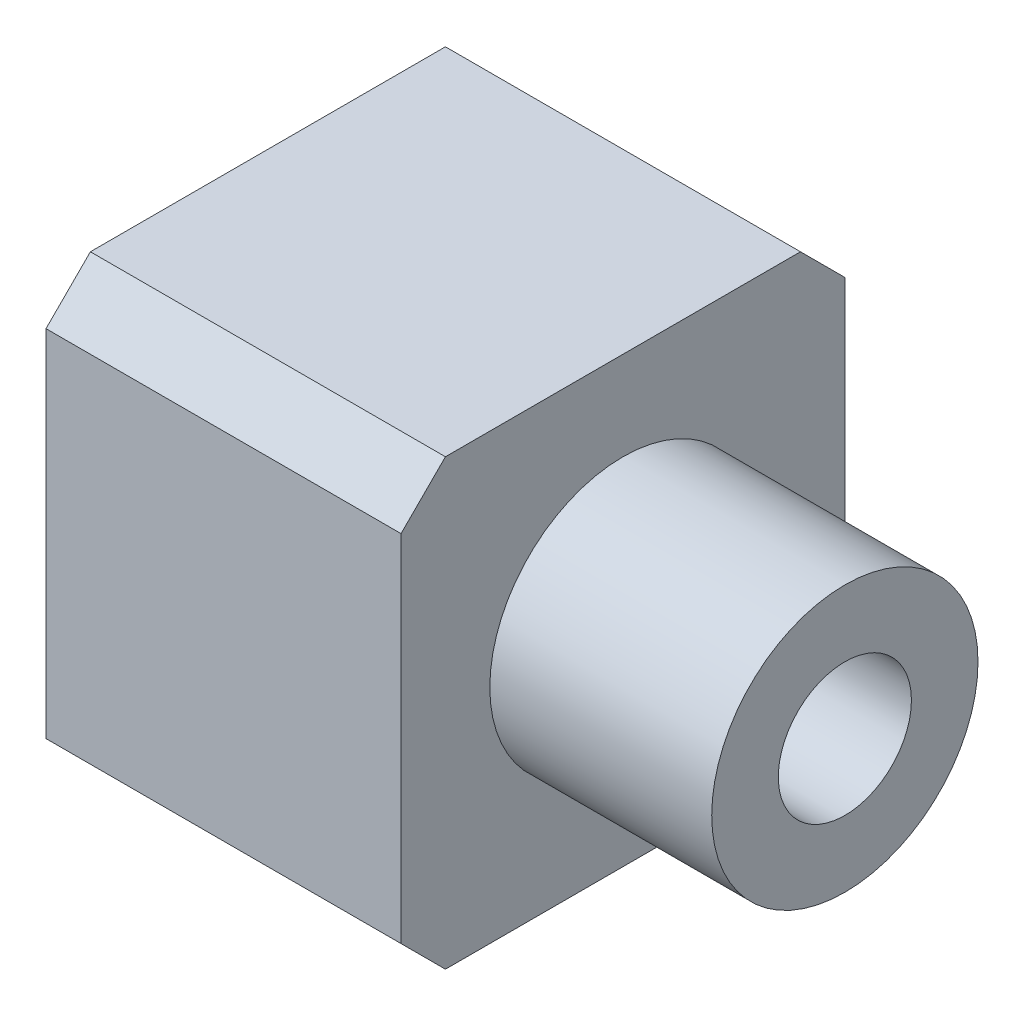
ISO-10303-21;
HEADER;
FILE_DESCRIPTION(('STEP AP214'),'2;1');
FILE_NAME('part.step','',(''),(''),'','','');
FILE_SCHEMA(('AUTOMOTIVE_DESIGN { 1 0 10303 214 1 1 1 1 }'));
ENDSEC;
DATA;
#1=APPLICATION_CONTEXT('core data for automotive mechanical design processes');
#2=APPLICATION_PROTOCOL_DEFINITION('international standard','automotive_design',2000,#1);
#3=PRODUCT_CONTEXT('',#1,'mechanical');
#4=PRODUCT('Part','Part','',(#3));
#5=PRODUCT_RELATED_PRODUCT_CATEGORY('part','',(#4));
#6=PRODUCT_DEFINITION_FORMATION('','',#4);
#7=PRODUCT_DEFINITION_CONTEXT('part definition',#1,'design');
#8=PRODUCT_DEFINITION('design','',#6,#7);
#9=PRODUCT_DEFINITION_SHAPE('','',#8);
#10=(LENGTH_UNIT() NAMED_UNIT(*) SI_UNIT(.MILLI.,.METRE.));
#11=(NAMED_UNIT(*) PLANE_ANGLE_UNIT() SI_UNIT($,.RADIAN.));
#12=(NAMED_UNIT(*) SI_UNIT($,.STERADIAN.) SOLID_ANGLE_UNIT());
#13=UNCERTAINTY_MEASURE_WITH_UNIT(LENGTH_MEASURE(1.E-05),#10,'distance_accuracy_value','');
#14=(GEOMETRIC_REPRESENTATION_CONTEXT(3) GLOBAL_UNCERTAINTY_ASSIGNED_CONTEXT((#13)) GLOBAL_UNIT_ASSIGNED_CONTEXT((#10,
#11,#12)) REPRESENTATION_CONTEXT('',''));
#15=CARTESIAN_POINT('',(0.,0.,0.));
#16=DIRECTION('',(0.,0.,1.));
#17=DIRECTION('',(1.,0.,0.));
#18=AXIS2_PLACEMENT_3D('',#15,#16,#17);
#19=CARTESIAN_POINT('',(-15.,-5.,5.));
#20=DIRECTION('',(0.,0.,1.));
#21=DIRECTION('',(1.,0.,0.));
#22=AXIS2_PLACEMENT_3D('',#19,#20,#21);
#23=PLANE('',#22);
#24=DIRECTION('',(0.,1.,0.));
#25=VECTOR('',#24,1.);
#26=CARTESIAN_POINT('',(-5.,-5.,5.));
#27=LINE('',#26,#25);
#28=CARTESIAN_POINT('',(-5.,-4.,5.));
#29=VERTEX_POINT('',#28);
#30=CARTESIAN_POINT('',(-5.,3.99999999999999,5.));
#31=VERTEX_POINT('',#30);
#32=EDGE_CURVE('E134',#29,#31,#27,.T.);
#33=ORIENTED_EDGE('',*,*,#32,.T.);
#34=DIRECTION('',(-1.,0.,0.));
#35=VECTOR('',#34,1.);
#36=CARTESIAN_POINT('',(-15.,3.99999999999999,5.));
#37=LINE('',#36,#35);
#38=CARTESIAN_POINT('',(-13.,3.99999999999999,5.));
#39=VERTEX_POINT('',#38);
#40=EDGE_CURVE('E11',#31,#39,#37,.T.);
#41=ORIENTED_EDGE('',*,*,#40,.T.);
#42=DIRECTION('',(0.,-1.,0.));
#43=VECTOR('',#42,1.);
#44=CARTESIAN_POINT('',(-13.,-5.,5.));
#45=LINE('',#44,#43);
#46=CARTESIAN_POINT('',(-13.,-4.,5.));
#47=VERTEX_POINT('',#46);
#48=EDGE_CURVE('E135',#39,#47,#45,.T.);
#49=ORIENTED_EDGE('',*,*,#48,.T.);
#50=DIRECTION('',(1.,0.,0.));
#51=VECTOR('',#50,1.);
#52=CARTESIAN_POINT('',(-15.,-4.,5.));
#53=LINE('',#52,#51);
#54=EDGE_CURVE('E43',#47,#29,#53,.T.);
#55=ORIENTED_EDGE('',*,*,#54,.T.);
#56=EDGE_LOOP('',(#33,#41,#49,#55));
#57=FACE_BOUND('',#56,.T.);
#58=ADVANCED_FACE('F35',(#57),#23,.T.);
#59=CARTESIAN_POINT('',(-15.,5.,-5.));
#60=DIRECTION('',(0.,1.,0.));
#61=DIRECTION('',(0.,0.,1.));
#62=AXIS2_PLACEMENT_3D('',#59,#60,#61);
#63=PLANE('',#62);
#64=DIRECTION('',(0.,0.,1.));
#65=VECTOR('',#64,1.);
#66=CARTESIAN_POINT('',(-13.,5.,-5.));
#67=LINE('',#66,#65);
#68=CARTESIAN_POINT('',(-13.,5.,-4.));
#69=VERTEX_POINT('',#68);
#70=CARTESIAN_POINT('',(-13.,5.,4.));
#71=VERTEX_POINT('',#70);
#72=EDGE_CURVE('E170',#69,#71,#67,.T.);
#73=ORIENTED_EDGE('',*,*,#72,.T.);
#74=DIRECTION('',(1.,0.,0.));
#75=VECTOR('',#74,1.);
#76=CARTESIAN_POINT('',(-15.,5.,4.));
#77=LINE('',#76,#75);
#78=CARTESIAN_POINT('',(-5.,5.,4.));
#79=VERTEX_POINT('',#78);
#80=EDGE_CURVE('E131',#71,#79,#77,.T.);
#81=ORIENTED_EDGE('',*,*,#80,.T.);
#82=DIRECTION('',(0.,0.,-1.));
#83=VECTOR('',#82,1.);
#84=CARTESIAN_POINT('',(-5.,5.,-5.));
#85=LINE('',#84,#83);
#86=CARTESIAN_POINT('',(-5.,5.,-4.));
#87=VERTEX_POINT('',#86);
#88=EDGE_CURVE('E142',#79,#87,#85,.T.);
#89=ORIENTED_EDGE('',*,*,#88,.T.);
#90=DIRECTION('',(-1.,0.,0.));
#91=VECTOR('',#90,1.);
#92=CARTESIAN_POINT('',(-15.,5.,-4.));
#93=LINE('',#92,#91);
#94=EDGE_CURVE('E129',#87,#69,#93,.T.);
#95=ORIENTED_EDGE('',*,*,#94,.T.);
#96=EDGE_LOOP('',(#73,#81,#89,#95));
#97=FACE_BOUND('',#96,.T.);
#98=ADVANCED_FACE('F211',(#97),#63,.T.);
#99=CARTESIAN_POINT('',(-15.,-5.,-5.));
#100=DIRECTION('',(0.,0.,-1.));
#101=DIRECTION('',(-1.,0.,0.));
#102=AXIS2_PLACEMENT_3D('',#99,#100,#101);
#103=PLANE('',#102);
#104=CARTESIAN_POINT('',(-9.,0.,-5.));
#105=DIRECTION('',(0.,0.,-1.));
#106=DIRECTION('',(-1.,0.,0.));
#107=AXIS2_PLACEMENT_3D('',#104,#105,#106);
#108=CIRCLE('',#107,1.5);
#109=CARTESIAN_POINT('',(-10.5,0.,-5.));
#110=VERTEX_POINT('',#109);
#111=EDGE_CURVE('E196',#110,#110,#108,.T.);
#112=ORIENTED_EDGE('',*,*,#111,.F.);
#113=EDGE_LOOP('',(#112));
#114=FACE_BOUND('',#113,.T.);
#115=DIRECTION('',(0.,-1.,0.));
#116=VECTOR('',#115,1.);
#117=CARTESIAN_POINT('',(-5.,-5.,-5.));
#118=LINE('',#117,#116);
#119=CARTESIAN_POINT('',(-5.,4.00000000000001,-5.));
#120=VERTEX_POINT('',#119);
#121=CARTESIAN_POINT('',(-5.,-3.99999999999999,-5.));
#122=VERTEX_POINT('',#121);
#123=EDGE_CURVE('E146',#120,#122,#118,.T.);
#124=ORIENTED_EDGE('',*,*,#123,.T.);
#125=DIRECTION('',(-1.,0.,0.));
#126=VECTOR('',#125,1.);
#127=CARTESIAN_POINT('',(-15.,-3.99999999999999,-5.));
#128=LINE('',#127,#126);
#129=CARTESIAN_POINT('',(-13.,-3.99999999999999,-5.));
#130=VERTEX_POINT('',#129);
#131=EDGE_CURVE('E124',#122,#130,#128,.T.);
#132=ORIENTED_EDGE('',*,*,#131,.T.);
#133=DIRECTION('',(0.,1.,0.));
#134=VECTOR('',#133,1.);
#135=CARTESIAN_POINT('',(-13.,-5.,-5.));
#136=LINE('',#135,#134);
#137=CARTESIAN_POINT('',(-13.,4.00000000000001,-5.));
#138=VERTEX_POINT('',#137);
#139=EDGE_CURVE('E164',#130,#138,#136,.T.);
#140=ORIENTED_EDGE('',*,*,#139,.T.);
#141=DIRECTION('',(1.,0.,0.));
#142=VECTOR('',#141,1.);
#143=CARTESIAN_POINT('',(-15.,4.00000000000001,-5.));
#144=LINE('',#143,#142);
#145=EDGE_CURVE('E157',#138,#120,#144,.T.);
#146=ORIENTED_EDGE('',*,*,#145,.T.);
#147=EDGE_LOOP('',(#124,#132,#140,#146));
#148=FACE_BOUND('',#147,.T.);
#149=ADVANCED_FACE('F163',(#114,#148),#103,.T.);
#150=CARTESIAN_POINT('',(-15.,-5.,-5.));
#151=DIRECTION('',(0.,-1.,0.));
#152=DIRECTION('',(0.,0.,-1.));
#153=AXIS2_PLACEMENT_3D('',#150,#151,#152);
#154=PLANE('',#153);
#155=DIRECTION('',(0.,0.,-1.));
#156=VECTOR('',#155,1.);
#157=CARTESIAN_POINT('',(-13.,-5.,-5.));
#158=LINE('',#157,#156);
#159=CARTESIAN_POINT('',(-13.,-5.,4.));
#160=VERTEX_POINT('',#159);
#161=CARTESIAN_POINT('',(-13.,-5.,-4.));
#162=VERTEX_POINT('',#161);
#163=EDGE_CURVE('E104',#160,#162,#158,.T.);
#164=ORIENTED_EDGE('',*,*,#163,.T.);
#165=DIRECTION('',(1.,0.,0.));
#166=VECTOR('',#165,1.);
#167=CARTESIAN_POINT('',(-15.,-5.,-4.));
#168=LINE('',#167,#166);
#169=CARTESIAN_POINT('',(-5.,-5.,-4.));
#170=VERTEX_POINT('',#169);
#171=EDGE_CURVE('E109',#162,#170,#168,.T.);
#172=ORIENTED_EDGE('',*,*,#171,.T.);
#173=DIRECTION('',(0.,0.,1.));
#174=VECTOR('',#173,1.);
#175=CARTESIAN_POINT('',(-5.,-5.,-5.));
#176=LINE('',#175,#174);
#177=CARTESIAN_POINT('',(-5.,-5.,4.));
#178=VERTEX_POINT('',#177);
#179=EDGE_CURVE('E107',#170,#178,#176,.T.);
#180=ORIENTED_EDGE('',*,*,#179,.T.);
#181=DIRECTION('',(-1.,0.,0.));
#182=VECTOR('',#181,1.);
#183=CARTESIAN_POINT('',(-15.,-5.,4.));
#184=LINE('',#183,#182);
#185=EDGE_CURVE('E101',#178,#160,#184,.T.);
#186=ORIENTED_EDGE('',*,*,#185,.T.);
#187=EDGE_LOOP('',(#164,#172,#180,#186));
#188=FACE_BOUND('',#187,.T.);
#189=ADVANCED_FACE('F102',(#188),#154,.T.);
#190=CARTESIAN_POINT('',(-5.,0.,0.));
#191=DIRECTION('',(1.,0.,0.));
#192=DIRECTION('',(0.,0.,-1.));
#193=AXIS2_PLACEMENT_3D('',#190,#191,#192);
#194=PLANE('',#193);
#195=ORIENTED_EDGE('',*,*,#179,.F.);
#196=DIRECTION('',(0.,-0.707106781186549,0.707106781186546));
#197=VECTOR('',#196,1.);
#198=CARTESIAN_POINT('',(-5.,-4.49999999999999,-4.50000000000001));
#199=LINE('',#198,#197);
#200=EDGE_CURVE('E155',#170,#122,#199,.F.);
#201=ORIENTED_EDGE('',*,*,#200,.T.);
#202=ORIENTED_EDGE('',*,*,#123,.F.);
#203=DIRECTION('',(0.,-0.707106781186546,-0.707106781186549));
#204=VECTOR('',#203,1.);
#205=CARTESIAN_POINT('',(-5.,4.50000000000001,-4.49999999999999));
#206=LINE('',#205,#204);
#207=EDGE_CURVE('E151',#120,#87,#206,.F.);
#208=ORIENTED_EDGE('',*,*,#207,.T.);
#209=ORIENTED_EDGE('',*,*,#88,.F.);
#210=DIRECTION('',(0.,0.707106781186549,-0.707106781186546));
#211=VECTOR('',#210,1.);
#212=CARTESIAN_POINT('',(-5.,4.49999999999999,4.50000000000001));
#213=LINE('',#212,#211);
#214=EDGE_CURVE('E141',#79,#31,#213,.F.);
#215=ORIENTED_EDGE('',*,*,#214,.T.);
#216=ORIENTED_EDGE('',*,*,#32,.F.);
#217=DIRECTION('',(0.,0.707106781186546,0.707106781186549));
#218=VECTOR('',#217,1.);
#219=CARTESIAN_POINT('',(-5.,-4.50000000000001,4.49999999999999));
#220=LINE('',#219,#218);
#221=EDGE_CURVE('E139',#29,#178,#220,.F.);
#222=ORIENTED_EDGE('',*,*,#221,.T.);
#223=EDGE_LOOP('',(#195,#201,#202,#208,#209,#215,#216,#222));
#224=FACE_BOUND('',#223,.T.);
#225=CARTESIAN_POINT('',(-5.,0.,0.));
#226=DIRECTION('',(1.,0.,0.));
#227=DIRECTION('',(0.,0.,-1.));
#228=AXIS2_PLACEMENT_3D('',#225,#226,#227);
#229=CIRCLE('',#228,3.);
#230=CARTESIAN_POINT('',(-5.,0.,-3.));
#231=VERTEX_POINT('',#230);
#232=EDGE_CURVE('E174',#231,#231,#229,.T.);
#233=ORIENTED_EDGE('',*,*,#232,.F.);
#234=EDGE_LOOP('',(#233));
#235=FACE_BOUND('',#234,.T.);
#236=ADVANCED_FACE('F137',(#224,#235),#194,.T.);
#237=CARTESIAN_POINT('',(-5.,0.,0.));
#238=DIRECTION('',(1.,0.,0.));
#239=DIRECTION('',(0.,0.,-1.));
#240=AXIS2_PLACEMENT_3D('',#237,#238,#239);
#241=CYLINDRICAL_SURFACE('',#240,3.);
#242=ORIENTED_EDGE('',*,*,#232,.T.);
#243=EDGE_LOOP('',(#242));
#244=FACE_BOUND('',#243,.T.);
#245=CARTESIAN_POINT('',(0.,0.,0.));
#246=DIRECTION('',(1.,0.,0.));
#247=DIRECTION('',(0.,0.,-1.));
#248=AXIS2_PLACEMENT_3D('',#245,#246,#247);
#249=CIRCLE('',#248,3.);
#250=CARTESIAN_POINT('',(0.,0.,-3.));
#251=VERTEX_POINT('',#250);
#252=EDGE_CURVE('E176',#251,#251,#249,.T.);
#253=ORIENTED_EDGE('',*,*,#252,.F.);
#254=EDGE_LOOP('',(#253));
#255=FACE_BOUND('',#254,.T.);
#256=ADVANCED_FACE('F329',(#244,#255),#241,.T.);
#257=CARTESIAN_POINT('',(0.,0.,0.));
#258=DIRECTION('',(1.,0.,0.));
#259=DIRECTION('',(0.,0.,-1.));
#260=AXIS2_PLACEMENT_3D('',#257,#258,#259);
#261=PLANE('',#260);
#262=CARTESIAN_POINT('',(0.,0.,0.));
#263=DIRECTION('',(1.,0.,0.));
#264=DIRECTION('',(0.,0.,-1.));
#265=AXIS2_PLACEMENT_3D('',#262,#263,#264);
#266=CIRCLE('',#265,1.5);
#267=CARTESIAN_POINT('',(0.,0.,-1.5));
#268=VERTEX_POINT('',#267);
#269=EDGE_CURVE('E190',#268,#268,#266,.T.);
#270=ORIENTED_EDGE('',*,*,#269,.F.);
#271=EDGE_LOOP('',(#270));
#272=FACE_BOUND('',#271,.T.);
#273=ORIENTED_EDGE('',*,*,#252,.T.);
#274=EDGE_LOOP('',(#273));
#275=FACE_BOUND('',#274,.T.);
#276=ADVANCED_FACE('F300',(#272,#275),#261,.T.);
#277=CARTESIAN_POINT('',(-13.,0.,0.));
#278=DIRECTION('',(-1.,0.,0.));
#279=DIRECTION('',(0.,0.,1.));
#280=AXIS2_PLACEMENT_3D('',#277,#278,#279);
#281=PLANE('',#280);
#282=ORIENTED_EDGE('',*,*,#139,.F.);
#283=DIRECTION('',(0.,0.707106781186549,-0.707106781186546));
#284=VECTOR('',#283,1.);
#285=CARTESIAN_POINT('',(-13.,-4.49999999999999,-4.50000000000001));
#286=LINE('',#285,#284);
#287=EDGE_CURVE('E115',#130,#162,#286,.F.);
#288=ORIENTED_EDGE('',*,*,#287,.T.);
#289=ORIENTED_EDGE('',*,*,#163,.F.);
#290=DIRECTION('',(0.,-0.707106781186546,-0.707106781186549));
#291=VECTOR('',#290,1.);
#292=CARTESIAN_POINT('',(-13.,-4.50000000000001,4.49999999999999));
#293=LINE('',#292,#291);
#294=EDGE_CURVE('E50',#160,#47,#293,.F.);
#295=ORIENTED_EDGE('',*,*,#294,.T.);
#296=ORIENTED_EDGE('',*,*,#48,.F.);
#297=DIRECTION('',(0.,-0.707106781186549,0.707106781186546));
#298=VECTOR('',#297,1.);
#299=CARTESIAN_POINT('',(-13.,4.49999999999999,4.50000000000001));
#300=LINE('',#299,#298);
#301=EDGE_CURVE('E120',#39,#71,#300,.F.);
#302=ORIENTED_EDGE('',*,*,#301,.T.);
#303=ORIENTED_EDGE('',*,*,#72,.F.);
#304=DIRECTION('',(0.,0.707106781186546,0.707106781186549));
#305=VECTOR('',#304,1.);
#306=CARTESIAN_POINT('',(-13.,4.50000000000001,-4.49999999999999));
#307=LINE('',#306,#305);
#308=EDGE_CURVE('E121',#69,#138,#307,.F.);
#309=ORIENTED_EDGE('',*,*,#308,.T.);
#310=EDGE_LOOP('',(#282,#288,#289,#295,#296,#302,#303,#309));
#311=FACE_BOUND('',#310,.T.);
#312=CARTESIAN_POINT('',(-13.,0.,0.));
#313=DIRECTION('',(-1.,0.,0.));
#314=DIRECTION('',(0.,0.,1.));
#315=AXIS2_PLACEMENT_3D('',#312,#313,#314);
#316=CIRCLE('',#315,3.);
#317=CARTESIAN_POINT('',(-13.,0.,3.));
#318=VERTEX_POINT('',#317);
#319=EDGE_CURVE('E171',#318,#318,#316,.T.);
#320=ORIENTED_EDGE('',*,*,#319,.F.);
#321=EDGE_LOOP('',(#320));
#322=FACE_BOUND('',#321,.T.);
#323=ADVANCED_FACE('F112',(#311,#322),#281,.T.);
#324=CARTESIAN_POINT('',(-13.,0.,0.));
#325=DIRECTION('',(-1.,0.,0.));
#326=DIRECTION('',(0.,0.,1.));
#327=AXIS2_PLACEMENT_3D('',#324,#325,#326);
#328=CYLINDRICAL_SURFACE('',#327,3.);
#329=ORIENTED_EDGE('',*,*,#319,.T.);
#330=EDGE_LOOP('',(#329));
#331=FACE_BOUND('',#330,.T.);
#332=CARTESIAN_POINT('',(-15.,0.,0.));
#333=DIRECTION('',(-1.,0.,0.));
#334=DIRECTION('',(0.,0.,1.));
#335=AXIS2_PLACEMENT_3D('',#332,#333,#334);
#336=CIRCLE('',#335,3.);
#337=CARTESIAN_POINT('',(-15.,0.,3.));
#338=VERTEX_POINT('',#337);
#339=EDGE_CURVE('E184',#338,#338,#336,.T.);
#340=ORIENTED_EDGE('',*,*,#339,.F.);
#341=EDGE_LOOP('',(#340));
#342=FACE_BOUND('',#341,.T.);
#343=ADVANCED_FACE('F285',(#331,#342),#328,.T.);
#344=CARTESIAN_POINT('',(-15.,0.,0.));
#345=DIRECTION('',(1.,0.,0.));
#346=DIRECTION('',(0.,0.,-1.));
#347=AXIS2_PLACEMENT_3D('',#344,#345,#346);
#348=PLANE('',#347);
#349=CARTESIAN_POINT('',(-15.,0.,0.));
#350=DIRECTION('',(1.,0.,0.));
#351=DIRECTION('',(0.,0.,-1.));
#352=AXIS2_PLACEMENT_3D('',#349,#350,#351);
#353=CIRCLE('',#352,1.5);
#354=CARTESIAN_POINT('',(-15.,0.,-1.5));
#355=VERTEX_POINT('',#354);
#356=EDGE_CURVE('E187',#355,#355,#353,.T.);
#357=ORIENTED_EDGE('',*,*,#356,.T.);
#358=EDGE_LOOP('',(#357));
#359=FACE_BOUND('',#358,.T.);
#360=ORIENTED_EDGE('',*,*,#339,.T.);
#361=EDGE_LOOP('',(#360));
#362=FACE_BOUND('',#361,.T.);
#363=ADVANCED_FACE('F280',(#359,#362),#348,.F.);
#364=CARTESIAN_POINT('',(-15.,0.,0.));
#365=DIRECTION('',(1.,0.,0.));
#366=DIRECTION('',(0.,0.,-1.));
#367=AXIS2_PLACEMENT_3D('',#364,#365,#366);
#368=CYLINDRICAL_SURFACE('',#367,1.5);
#369=ORIENTED_EDGE('',*,*,#356,.F.);
#370=EDGE_LOOP('',(#369));
#371=FACE_BOUND('',#370,.T.);
#372=ORIENTED_EDGE('',*,*,#269,.T.);
#373=EDGE_LOOP('',(#372));
#374=FACE_BOUND('',#373,.T.);
#375=ADVANCED_FACE('F228',(#371,#374),#368,.F.);
#376=CARTESIAN_POINT('',(-15.,-5.,-4.));
#377=DIRECTION('',(0.,0.707106781186546,0.707106781186549));
#378=DIRECTION('',(1.,0.,0.));
#379=AXIS2_PLACEMENT_3D('',#376,#377,#378);
#380=PLANE('',#379);
#381=ORIENTED_EDGE('',*,*,#287,.F.);
#382=ORIENTED_EDGE('',*,*,#131,.F.);
#383=ORIENTED_EDGE('',*,*,#200,.F.);
#384=ORIENTED_EDGE('',*,*,#171,.F.);
#385=EDGE_LOOP('',(#381,#382,#383,#384));
#386=FACE_BOUND('',#385,.T.);
#387=ADVANCED_FACE('F173',(#386),#380,.F.);
#388=CARTESIAN_POINT('',(-15.,5.,4.));
#389=DIRECTION('',(0.,-0.707106781186546,-0.707106781186549));
#390=DIRECTION('',(1.,0.,0.));
#391=AXIS2_PLACEMENT_3D('',#388,#389,#390);
#392=PLANE('',#391);
#393=ORIENTED_EDGE('',*,*,#301,.F.);
#394=ORIENTED_EDGE('',*,*,#40,.F.);
#395=ORIENTED_EDGE('',*,*,#214,.F.);
#396=ORIENTED_EDGE('',*,*,#80,.F.);
#397=EDGE_LOOP('',(#393,#394,#395,#396));
#398=FACE_BOUND('',#397,.T.);
#399=ADVANCED_FACE('F227',(#398),#392,.F.);
#400=CARTESIAN_POINT('',(-15.,-4.,5.));
#401=DIRECTION('',(0.,0.707106781186549,-0.707106781186546));
#402=DIRECTION('',(1.,0.,0.));
#403=AXIS2_PLACEMENT_3D('',#400,#401,#402);
#404=PLANE('',#403);
#405=ORIENTED_EDGE('',*,*,#294,.F.);
#406=ORIENTED_EDGE('',*,*,#185,.F.);
#407=ORIENTED_EDGE('',*,*,#221,.F.);
#408=ORIENTED_EDGE('',*,*,#54,.F.);
#409=EDGE_LOOP('',(#405,#406,#407,#408));
#410=FACE_BOUND('',#409,.T.);
#411=ADVANCED_FACE('F118',(#410),#404,.F.);
#412=CARTESIAN_POINT('',(-15.,4.00000000000001,-5.));
#413=DIRECTION('',(0.,-0.707106781186549,0.707106781186546));
#414=DIRECTION('',(1.,0.,0.));
#415=AXIS2_PLACEMENT_3D('',#412,#413,#414);
#416=PLANE('',#415);
#417=ORIENTED_EDGE('',*,*,#308,.F.);
#418=ORIENTED_EDGE('',*,*,#94,.F.);
#419=ORIENTED_EDGE('',*,*,#207,.F.);
#420=ORIENTED_EDGE('',*,*,#145,.F.);
#421=EDGE_LOOP('',(#417,#418,#419,#420));
#422=FACE_BOUND('',#421,.T.);
#423=ADVANCED_FACE('F37',(#422),#416,.F.);
#424=CARTESIAN_POINT('',(-9.,0.,-3.));
#425=DIRECTION('',(0.,0.,-1.));
#426=DIRECTION('',(-1.,0.,0.));
#427=AXIS2_PLACEMENT_3D('',#424,#425,#426);
#428=CYLINDRICAL_SURFACE('',#427,1.5);
#429=CARTESIAN_POINT('',(-9.,0.,-3.));
#430=DIRECTION('',(0.,0.,-1.));
#431=DIRECTION('',(-1.,0.,0.));
#432=AXIS2_PLACEMENT_3D('',#429,#430,#431);
#433=CIRCLE('',#432,1.5);
#434=CARTESIAN_POINT('',(-10.5,0.,-3.));
#435=VERTEX_POINT('',#434);
#436=EDGE_CURVE('E193',#435,#435,#433,.T.);
#437=ORIENTED_EDGE('',*,*,#436,.F.);
#438=EDGE_LOOP('',(#437));
#439=FACE_BOUND('',#438,.T.);
#440=ORIENTED_EDGE('',*,*,#111,.T.);
#441=EDGE_LOOP('',(#440));
#442=FACE_BOUND('',#441,.T.);
#443=ADVANCED_FACE('F204',(#439,#442),#428,.F.);
#444=CARTESIAN_POINT('',(-9.,0.,-3.));
#445=DIRECTION('',(0.,0.,-1.));
#446=DIRECTION('',(-1.,0.,0.));
#447=AXIS2_PLACEMENT_3D('',#444,#445,#446);
#448=PLANE('',#447);
#449=ORIENTED_EDGE('',*,*,#436,.T.);
#450=EDGE_LOOP('',(#449));
#451=FACE_BOUND('',#450,.T.);
#452=ADVANCED_FACE('F202',(#451),#448,.T.);
#453=CLOSED_SHELL('',(#58,#98,#149,#189,#236,#256,#276,#323,#343,#363,#375,#387,#399,#411,#423,
#443,#452));
#454=MANIFOLD_SOLID_BREP('B2',#453);
#455=ADVANCED_BREP_SHAPE_REPRESENTATION('',(#18,#454),#14);
#456=SHAPE_DEFINITION_REPRESENTATION(#9,#455);
ENDSEC;
END-ISO-10303-21;
